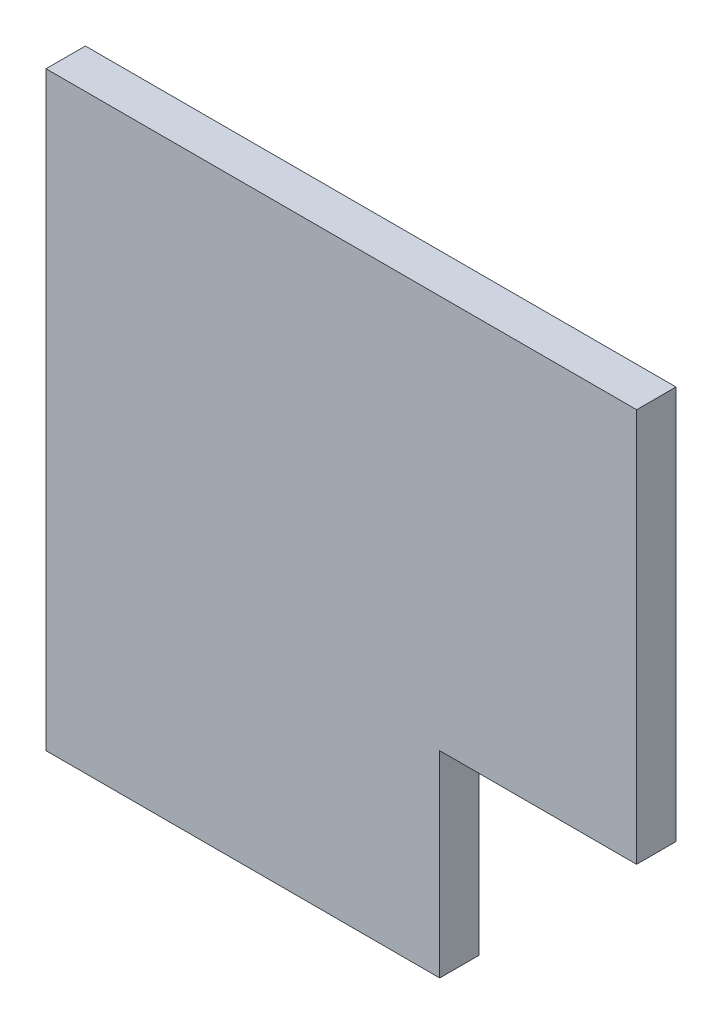
ISO-10303-21;
HEADER;
FILE_DESCRIPTION(('STEP AP214'),'2;1');
FILE_NAME('part.step','',(''),(''),'','','');
FILE_SCHEMA(('AUTOMOTIVE_DESIGN { 1 0 10303 214 1 1 1 1 }'));
ENDSEC;
DATA;
#1=APPLICATION_CONTEXT('core data for automotive mechanical design processes');
#2=APPLICATION_PROTOCOL_DEFINITION('international standard','automotive_design',2000,#1);
#3=PRODUCT_CONTEXT('',#1,'mechanical');
#4=PRODUCT('Part','Part','',(#3));
#5=PRODUCT_RELATED_PRODUCT_CATEGORY('part','',(#4));
#6=PRODUCT_DEFINITION_FORMATION('','',#4);
#7=PRODUCT_DEFINITION_CONTEXT('part definition',#1,'design');
#8=PRODUCT_DEFINITION('design','',#6,#7);
#9=PRODUCT_DEFINITION_SHAPE('','',#8);
#10=(LENGTH_UNIT() NAMED_UNIT(*) SI_UNIT(.MILLI.,.METRE.));
#11=(NAMED_UNIT(*) PLANE_ANGLE_UNIT() SI_UNIT($,.RADIAN.));
#12=(NAMED_UNIT(*) SI_UNIT($,.STERADIAN.) SOLID_ANGLE_UNIT());
#13=UNCERTAINTY_MEASURE_WITH_UNIT(LENGTH_MEASURE(1.E-05),#10,'distance_accuracy_value','');
#14=(GEOMETRIC_REPRESENTATION_CONTEXT(3) GLOBAL_UNCERTAINTY_ASSIGNED_CONTEXT((#13)) GLOBAL_UNIT_ASSIGNED_CONTEXT((#10,
#11,#12)) REPRESENTATION_CONTEXT('',''));
#15=CARTESIAN_POINT('',(0.,0.,0.));
#16=DIRECTION('',(0.,0.,1.));
#17=DIRECTION('',(1.,0.,0.));
#18=AXIS2_PLACEMENT_3D('',#15,#16,#17);
#19=CARTESIAN_POINT('',(-0.5,0.,0.05));
#20=DIRECTION('',(0.,1.,0.));
#21=DIRECTION('',(0.,0.,1.));
#22=AXIS2_PLACEMENT_3D('',#19,#20,#21);
#23=PLANE('',#22);
#24=DIRECTION('',(1.,0.,0.));
#25=VECTOR('',#24,1.);
#26=CARTESIAN_POINT('',(-0.5,0.,-0.05));
#27=LINE('',#26,#25);
#28=CARTESIAN_POINT('',(-0.5,0.,-0.05));
#29=VERTEX_POINT('',#28);
#30=CARTESIAN_POINT('',(0.,0.,-0.05));
#31=VERTEX_POINT('',#30);
#32=EDGE_CURVE('E128',#29,#31,#27,.T.);
#33=ORIENTED_EDGE('',*,*,#32,.T.);
#34=DIRECTION('',(0.,0.,-1.));
#35=VECTOR('',#34,1.);
#36=CARTESIAN_POINT('',(0.,0.,0.05));
#37=LINE('',#36,#35);
#38=CARTESIAN_POINT('',(0.,0.,0.05));
#39=VERTEX_POINT('',#38);
#40=EDGE_CURVE('E11',#39,#31,#37,.T.);
#41=ORIENTED_EDGE('',*,*,#40,.F.);
#42=DIRECTION('',(1.,0.,0.));
#43=VECTOR('',#42,1.);
#44=CARTESIAN_POINT('',(-0.5,0.,0.05));
#45=LINE('',#44,#43);
#46=CARTESIAN_POINT('',(-0.5,0.,0.05));
#47=VERTEX_POINT('',#46);
#48=EDGE_CURVE('E144',#47,#39,#45,.T.);
#49=ORIENTED_EDGE('',*,*,#48,.F.);
#50=DIRECTION('',(0.,0.,-1.));
#51=VECTOR('',#50,1.);
#52=CARTESIAN_POINT('',(-0.5,0.,0.05));
#53=LINE('',#52,#51);
#54=EDGE_CURVE('E124',#47,#29,#53,.T.);
#55=ORIENTED_EDGE('',*,*,#54,.T.);
#56=EDGE_LOOP('',(#33,#41,#49,#55));
#57=FACE_BOUND('',#56,.T.);
#58=ADVANCED_FACE('F39',(#57),#23,.F.);
#59=CARTESIAN_POINT('',(0.,0.,0.05));
#60=DIRECTION('',(-1.,0.,0.));
#61=DIRECTION('',(0.,0.,1.));
#62=AXIS2_PLACEMENT_3D('',#59,#60,#61);
#63=PLANE('',#62);
#64=DIRECTION('',(0.,1.,0.));
#65=VECTOR('',#64,1.);
#66=CARTESIAN_POINT('',(0.,0.,-0.05));
#67=LINE('',#66,#65);
#68=CARTESIAN_POINT('',(0.,1.,-0.05));
#69=VERTEX_POINT('',#68);
#70=EDGE_CURVE('E132',#31,#69,#67,.T.);
#71=ORIENTED_EDGE('',*,*,#70,.T.);
#72=DIRECTION('',(0.,0.,-1.));
#73=VECTOR('',#72,1.);
#74=CARTESIAN_POINT('',(0.,1.,0.05));
#75=LINE('',#74,#73);
#76=CARTESIAN_POINT('',(0.,1.,0.05));
#77=VERTEX_POINT('',#76);
#78=EDGE_CURVE('E48',#77,#69,#75,.T.);
#79=ORIENTED_EDGE('',*,*,#78,.F.);
#80=DIRECTION('',(0.,1.,0.));
#81=VECTOR('',#80,1.);
#82=CARTESIAN_POINT('',(0.,0.,0.05));
#83=LINE('',#82,#81);
#84=EDGE_CURVE('E93',#39,#77,#83,.T.);
#85=ORIENTED_EDGE('',*,*,#84,.F.);
#86=ORIENTED_EDGE('',*,*,#40,.T.);
#87=EDGE_LOOP('',(#71,#79,#85,#86));
#88=FACE_BOUND('',#87,.T.);
#89=ADVANCED_FACE('F172',(#88),#63,.F.);
#90=CARTESIAN_POINT('',(0.,1.,0.05));
#91=DIRECTION('',(0.,-1.,0.));
#92=DIRECTION('',(1.,0.,0.));
#93=AXIS2_PLACEMENT_3D('',#90,#91,#92);
#94=PLANE('',#93);
#95=DIRECTION('',(-1.,0.,0.));
#96=VECTOR('',#95,1.);
#97=CARTESIAN_POINT('',(0.,1.,-0.05));
#98=LINE('',#97,#96);
#99=CARTESIAN_POINT('',(-1.5,1.,-0.05));
#100=VERTEX_POINT('',#99);
#101=EDGE_CURVE('E135',#69,#100,#98,.T.);
#102=ORIENTED_EDGE('',*,*,#101,.T.);
#103=DIRECTION('',(0.,0.,-1.));
#104=VECTOR('',#103,1.);
#105=CARTESIAN_POINT('',(-1.5,1.,0.05));
#106=LINE('',#105,#104);
#107=CARTESIAN_POINT('',(-1.5,1.,0.05));
#108=VERTEX_POINT('',#107);
#109=EDGE_CURVE('E117',#108,#100,#106,.T.);
#110=ORIENTED_EDGE('',*,*,#109,.F.);
#111=DIRECTION('',(-1.,0.,0.));
#112=VECTOR('',#111,1.);
#113=CARTESIAN_POINT('',(0.,1.,0.05));
#114=LINE('',#113,#112);
#115=EDGE_CURVE('E106',#77,#108,#114,.T.);
#116=ORIENTED_EDGE('',*,*,#115,.F.);
#117=ORIENTED_EDGE('',*,*,#78,.T.);
#118=EDGE_LOOP('',(#102,#110,#116,#117));
#119=FACE_BOUND('',#118,.T.);
#120=ADVANCED_FACE('F154',(#119),#94,.F.);
#121=CARTESIAN_POINT('',(-1.5,1.,0.05));
#122=DIRECTION('',(1.,0.,0.));
#123=DIRECTION('',(0.,0.,-1.));
#124=AXIS2_PLACEMENT_3D('',#121,#122,#123);
#125=PLANE('',#124);
#126=DIRECTION('',(0.,-1.,0.));
#127=VECTOR('',#126,1.);
#128=CARTESIAN_POINT('',(-1.5,1.,-0.05));
#129=LINE('',#128,#127);
#130=CARTESIAN_POINT('',(-1.5,-0.5,-0.05));
#131=VERTEX_POINT('',#130);
#132=EDGE_CURVE('E115',#100,#131,#129,.T.);
#133=ORIENTED_EDGE('',*,*,#132,.T.);
#134=DIRECTION('',(0.,0.,-1.));
#135=VECTOR('',#134,1.);
#136=CARTESIAN_POINT('',(-1.5,-0.5,0.05));
#137=LINE('',#136,#135);
#138=CARTESIAN_POINT('',(-1.5,-0.5,0.05));
#139=VERTEX_POINT('',#138);
#140=EDGE_CURVE('E112',#139,#131,#137,.T.);
#141=ORIENTED_EDGE('',*,*,#140,.F.);
#142=DIRECTION('',(0.,-1.,0.));
#143=VECTOR('',#142,1.);
#144=CARTESIAN_POINT('',(-1.5,1.,0.05));
#145=LINE('',#144,#143);
#146=EDGE_CURVE('E100',#108,#139,#145,.T.);
#147=ORIENTED_EDGE('',*,*,#146,.F.);
#148=ORIENTED_EDGE('',*,*,#109,.T.);
#149=EDGE_LOOP('',(#133,#141,#147,#148));
#150=FACE_BOUND('',#149,.T.);
#151=ADVANCED_FACE('F113',(#150),#125,.F.);
#152=CARTESIAN_POINT('',(-1.5,-0.5,0.05));
#153=DIRECTION('',(0.,1.,0.));
#154=DIRECTION('',(0.,0.,1.));
#155=AXIS2_PLACEMENT_3D('',#152,#153,#154);
#156=PLANE('',#155);
#157=DIRECTION('',(1.,0.,0.));
#158=VECTOR('',#157,1.);
#159=CARTESIAN_POINT('',(-1.5,-0.5,-0.05));
#160=LINE('',#159,#158);
#161=CARTESIAN_POINT('',(-0.5,-0.5,-0.05));
#162=VERTEX_POINT('',#161);
#163=EDGE_CURVE('E79',#131,#162,#160,.T.);
#164=ORIENTED_EDGE('',*,*,#163,.T.);
#165=DIRECTION('',(0.,0.,-1.));
#166=VECTOR('',#165,1.);
#167=CARTESIAN_POINT('',(-0.5,-0.5,0.05));
#168=LINE('',#167,#166);
#169=CARTESIAN_POINT('',(-0.5,-0.5,0.05));
#170=VERTEX_POINT('',#169);
#171=EDGE_CURVE('E118',#170,#162,#168,.T.);
#172=ORIENTED_EDGE('',*,*,#171,.F.);
#173=DIRECTION('',(1.,0.,0.));
#174=VECTOR('',#173,1.);
#175=CARTESIAN_POINT('',(-1.5,-0.5,0.05));
#176=LINE('',#175,#174);
#177=EDGE_CURVE('E104',#139,#170,#176,.T.);
#178=ORIENTED_EDGE('',*,*,#177,.F.);
#179=ORIENTED_EDGE('',*,*,#140,.T.);
#180=EDGE_LOOP('',(#164,#172,#178,#179));
#181=FACE_BOUND('',#180,.T.);
#182=ADVANCED_FACE('F120',(#181),#156,.F.);
#183=CARTESIAN_POINT('',(-0.5,-0.5,0.05));
#184=DIRECTION('',(-1.,0.,0.));
#185=DIRECTION('',(0.,0.,1.));
#186=AXIS2_PLACEMENT_3D('',#183,#184,#185);
#187=PLANE('',#186);
#188=DIRECTION('',(0.,1.,0.));
#189=VECTOR('',#188,1.);
#190=CARTESIAN_POINT('',(-0.5,-0.5,-0.05));
#191=LINE('',#190,#189);
#192=EDGE_CURVE('E85',#162,#29,#191,.T.);
#193=ORIENTED_EDGE('',*,*,#192,.T.);
#194=ORIENTED_EDGE('',*,*,#54,.F.);
#195=DIRECTION('',(0.,1.,0.));
#196=VECTOR('',#195,1.);
#197=CARTESIAN_POINT('',(-0.5,-0.5,0.05));
#198=LINE('',#197,#196);
#199=EDGE_CURVE('E56',#170,#47,#198,.T.);
#200=ORIENTED_EDGE('',*,*,#199,.F.);
#201=ORIENTED_EDGE('',*,*,#171,.T.);
#202=EDGE_LOOP('',(#193,#194,#200,#201));
#203=FACE_BOUND('',#202,.T.);
#204=ADVANCED_FACE('F161',(#203),#187,.F.);
#205=CARTESIAN_POINT('',(0.,0.,0.05));
#206=DIRECTION('',(0.,0.,1.));
#207=DIRECTION('',(1.,0.,0.));
#208=AXIS2_PLACEMENT_3D('',#205,#206,#207);
#209=PLANE('',#208);
#210=ORIENTED_EDGE('',*,*,#48,.T.);
#211=ORIENTED_EDGE('',*,*,#84,.T.);
#212=ORIENTED_EDGE('',*,*,#115,.T.);
#213=ORIENTED_EDGE('',*,*,#146,.T.);
#214=ORIENTED_EDGE('',*,*,#177,.T.);
#215=ORIENTED_EDGE('',*,*,#199,.T.);
#216=EDGE_LOOP('',(#210,#211,#212,#213,#214,#215));
#217=FACE_BOUND('',#216,.T.);
#218=ADVANCED_FACE('F102',(#217),#209,.T.);
#219=CARTESIAN_POINT('',(0.,0.,-0.05));
#220=DIRECTION('',(0.,0.,1.));
#221=DIRECTION('',(1.,0.,0.));
#222=AXIS2_PLACEMENT_3D('',#219,#220,#221);
#223=PLANE('',#222);
#224=ORIENTED_EDGE('',*,*,#32,.F.);
#225=ORIENTED_EDGE('',*,*,#192,.F.);
#226=ORIENTED_EDGE('',*,*,#163,.F.);
#227=ORIENTED_EDGE('',*,*,#132,.F.);
#228=ORIENTED_EDGE('',*,*,#101,.F.);
#229=ORIENTED_EDGE('',*,*,#70,.F.);
#230=EDGE_LOOP('',(#224,#225,#226,#227,#228,#229));
#231=FACE_BOUND('',#230,.T.);
#232=ADVANCED_FACE('F157',(#231),#223,.F.);
#233=CLOSED_SHELL('',(#58,#89,#120,#151,#182,#204,#218,#232));
#234=MANIFOLD_SOLID_BREP('B2',#233);
#235=ADVANCED_BREP_SHAPE_REPRESENTATION('',(#18,#234),#14);
#236=SHAPE_DEFINITION_REPRESENTATION(#9,#235);
ENDSEC;
END-ISO-10303-21;
